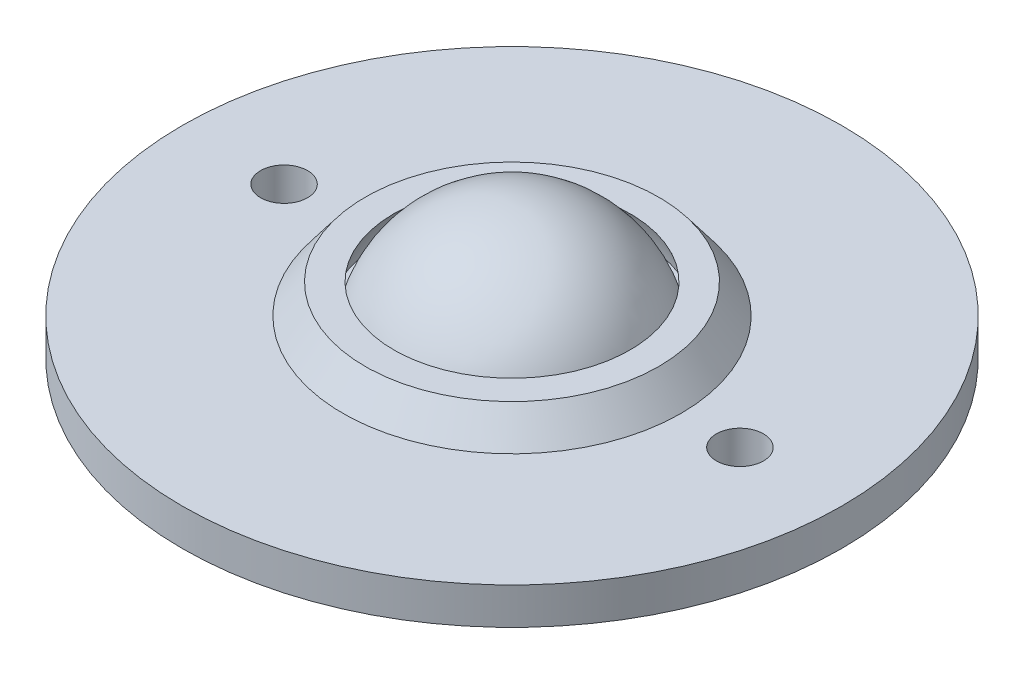
ISO-10303-21;
HEADER;
FILE_DESCRIPTION(('STEP AP214'),'2;1');
FILE_NAME('part.step','',(''),(''),'','','');
FILE_SCHEMA(('AUTOMOTIVE_DESIGN { 1 0 10303 214 1 1 1 1 }'));
ENDSEC;
DATA;
#1=APPLICATION_CONTEXT('core data for automotive mechanical design processes');
#2=APPLICATION_PROTOCOL_DEFINITION('international standard','automotive_design',2000,#1);
#3=PRODUCT_CONTEXT('',#1,'mechanical');
#4=PRODUCT('Part','Part','',(#3));
#5=PRODUCT_RELATED_PRODUCT_CATEGORY('part','',(#4));
#6=PRODUCT_DEFINITION_FORMATION('','',#4);
#7=PRODUCT_DEFINITION_CONTEXT('part definition',#1,'design');
#8=PRODUCT_DEFINITION('design','',#6,#7);
#9=PRODUCT_DEFINITION_SHAPE('','',#8);
#10=(LENGTH_UNIT() NAMED_UNIT(*) SI_UNIT(.MILLI.,.METRE.));
#11=(NAMED_UNIT(*) PLANE_ANGLE_UNIT() SI_UNIT($,.RADIAN.));
#12=(NAMED_UNIT(*) SI_UNIT($,.STERADIAN.) SOLID_ANGLE_UNIT());
#13=UNCERTAINTY_MEASURE_WITH_UNIT(LENGTH_MEASURE(1.E-05),#10,'distance_accuracy_value','');
#14=(GEOMETRIC_REPRESENTATION_CONTEXT(3) GLOBAL_UNCERTAINTY_ASSIGNED_CONTEXT((#13)) GLOBAL_UNIT_ASSIGNED_CONTEXT((#10,
#11,#12)) REPRESENTATION_CONTEXT('',''));
#15=CARTESIAN_POINT('',(0.,0.,0.));
#16=DIRECTION('',(0.,0.,1.));
#17=DIRECTION('',(1.,0.,0.));
#18=AXIS2_PLACEMENT_3D('',#15,#16,#17);
#19=CARTESIAN_POINT('',(0.,-1.09899153511606,0.));
#20=DIRECTION('',(0.,-1.,0.));
#21=DIRECTION('',(-1.,0.,0.));
#22=AXIS2_PLACEMENT_3D('',#19,#20,#21);
#23=SPHERICAL_SURFACE('',#22,9.);
#24=CARTESIAN_POINT('',(0.,0.961485209223222,0.));
#25=DIRECTION('',(0.,-1.,0.));
#26=DIRECTION('',(1.,0.,0.));
#27=AXIS2_PLACEMENT_3D('',#24,#25,#26);
#28=CIRCLE('',#27,8.76096088257658);
#29=CARTESIAN_POINT('',(-8.76096088257659,0.961485209223198,0.));
#30=VERTEX_POINT('',#29);
#31=EDGE_CURVE('E51',#30,#30,#28,.T.);
#32=CARTESIAN_POINT('',(0.,2.96148520922322,0.));
#33=DIRECTION('',(0.,-1.,0.));
#34=DIRECTION('',(1.,0.,0.));
#35=AXIS2_PLACEMENT_3D('',#32,#33,#34);
#36=CIRCLE('',#35,8.0319691613377);
#37=CARTESIAN_POINT('',(-8.03196916133771,2.9614852092232,0.));
#38=VERTEX_POINT('',#37);
#39=EDGE_CURVE('E41',#38,#38,#36,.T.);
#40=CARTESIAN_POINT('',(-8.76096088257659,0.961485209223198,0.));
#41=CARTESIAN_POINT('',(-8.7558723918076,0.983121019142818,0.));
#42=CARTESIAN_POINT('',(-8.75070375120882,1.00473797872741,0.));
#43=CARTESIAN_POINT('',(-8.74020646097857,1.04793301238198,0.));
#44=CARTESIAN_POINT('',(-8.7348778113471,1.06951108645197,0.));
#45=CARTESIAN_POINT('',(-8.7240607936784,1.11262716423276,0.));
#46=CARTESIAN_POINT('',(-8.71857242564116,1.13416516794357,0.));
#47=CARTESIAN_POINT('',(-8.7074362729079,1.17719992293278,0.));
#48=CARTESIAN_POINT('',(-8.70178848821187,1.19869667421118,0.));
#49=CARTESIAN_POINT('',(-8.69033381202761,1.24164774437339,0.));
#50=CARTESIAN_POINT('',(-8.68452692053937,1.26310206325719,0.));
#51=CARTESIAN_POINT('',(-8.67275434953942,1.30596709103813,0.));
#52=CARTESIAN_POINT('',(-8.6667886700277,1.32737779993526,0.));
#53=CARTESIAN_POINT('',(-8.65469885041989,1.3701544325335,0.));
#54=CARTESIAN_POINT('',(-8.64857471032381,1.3915203562346,0.));
#55=CARTESIAN_POINT('',(-8.63616830569623,1.43420624569255,0.));
#56=CARTESIAN_POINT('',(-8.62988604116474,1.45552621144939,0.));
#57=CARTESIAN_POINT('',(-8.61716373249131,1.49811901479239,0.));
#58=CARTESIAN_POINT('',(-8.61072368834938,1.51939185237855,0.));
#59=CARTESIAN_POINT('',(-8.59768617394122,1.56188923174075,0.));
#60=CARTESIAN_POINT('',(-8.59108870367499,1.5831137735168,0.));
#61=CARTESIAN_POINT('',(-8.5777366991451,1.62551339627021,0.));
#62=CARTESIAN_POINT('',(-8.57098216488143,1.64668847724757,0.));
#63=CARTESIAN_POINT('',(-8.5573164031046,1.68898801612989,0.));
#64=CARTESIAN_POINT('',(-8.55040517559144,1.71011247403485,0.));
#65=CARTESIAN_POINT('',(-8.53642640666427,1.75230960727727,0.));
#66=CARTESIAN_POINT('',(-8.52935886525026,1.77338228261474,0.));
#67=CARTESIAN_POINT('',(-8.5150678564499,1.81547469406937,0.));
#68=CARTESIAN_POINT('',(-8.50784438906355,1.83649443018653,0.));
#69=CARTESIAN_POINT('',(-8.4932419248056,1.87847980945352,0.));
#70=CARTESIAN_POINT('',(-8.48586292793401,1.89944545260335,0.));
#71=CARTESIAN_POINT('',(-8.47094980972949,1.94132149515773,0.));
#72=CARTESIAN_POINT('',(-8.46341568839656,1.96223189456227,0.));
#73=CARTESIAN_POINT('',(-8.44819273480788,2.0039963018804,0.));
#74=CARTESIAN_POINT('',(-8.44050390255212,2.02485030979399,0.));
#75=CARTESIAN_POINT('',(-8.42497194914817,2.06650078947976,0.));
#76=CARTESIAN_POINT('',(-8.41712882799998,2.08729726125196,0.));
#77=CARTESIAN_POINT('',(-8.40128872731027,2.12883152716262,0.));
#78=CARTESIAN_POINT('',(-8.39329174776875,2.14956932130109,0.));
#79=CARTESIAN_POINT('',(-8.3771443692366,2.1909850936727,0.));
#80=CARTESIAN_POINT('',(-8.36899397024596,2.21166307190585,0.));
#81=CARTESIAN_POINT('',(-8.35254020018079,2.25295807747844,0.));
#82=CARTESIAN_POINT('',(-8.34423682910626,2.27357510481789,0.));
#83=CARTESIAN_POINT('',(-8.32747757063495,2.31474707696023,0.));
#84=CARTESIAN_POINT('',(-8.31902168323817,2.33530202176312,0.));
#85=CARTESIAN_POINT('',(-8.30195785625545,2.37634870059712,0.));
#86=CARTESIAN_POINT('',(-8.29334991666951,2.39684043462823,0.));
#87=CARTESIAN_POINT('',(-8.27598245778755,2.43775956715302,0.));
#88=CARTESIAN_POINT('',(-8.26722293849153,2.4581869656467,0.));
#89=CARTESIAN_POINT('',(-8.24955280098832,2.49897630586219,0.));
#90=CARTESIAN_POINT('',(-8.24064218278112,2.519338247584,0.));
#91=CARTESIAN_POINT('',(-8.22267033654886,2.55999555661452,0.));
#92=CARTESIAN_POINT('',(-8.2136091085238,2.58029092392323,0.));
#93=CARTESIAN_POINT('',(-8.19533654001296,2.62081397013906,0.));
#94=CARTESIAN_POINT('',(-8.18612519952716,2.64104164904618,0.));
#95=CARTESIAN_POINT('',(-8.16755291170262,2.68142820819117,0.));
#96=CARTESIAN_POINT('',(-8.15819196436387,2.70158708842905,0.));
#97=CARTESIAN_POINT('',(-8.13932097661119,2.7418349437235,0.));
#98=CARTESIAN_POINT('',(-8.12981093619727,2.76192391878008,0.));
#99=CARTESIAN_POINT('',(-8.11064228441132,2.80203086111415,0.));
#100=CARTESIAN_POINT('',(-8.10098367303929,2.82204882839166,0.));
#101=CARTESIAN_POINT('',(-8.0815184090278,2.86201265617889,0.));
#102=CARTESIAN_POINT('',(-8.07171175638833,2.88195851668861,0.));
#103=CARTESIAN_POINT('',(-8.05195094982778,2.92177703698601,0.));
#104=CARTESIAN_POINT('',(-8.04199679590669,2.94164969677368,0.));
#105=CARTESIAN_POINT('',(-8.03196916133771,2.9614852092232,0.));
#106=B_SPLINE_CURVE_WITH_KNOTS('',3,(#40,#41,#42,#43,#44,#45,#46,#47,#48,#49,#50,#51,#52,#53,
#54,#55,#56,#57,#58,#59,#60,#61,#62,#63,#64,#65,#66,#67,#68,#69,#70,#71,#72,#73,#74,#75,#76,#77,
#78,#79,#80,#81,#82,#83,#84,#85,#86,#87,#88,#89,#90,#91,#92,#93,#94,#95,#96,#97,#98,#99,#100,
#101,#102,#103,#104,#105),.UNSPECIFIED.,.F.,.F.,(4,2,2,2,2,2,2,2,2,2,2,2,2,2,2,2,2,2,2,2,2,2,2,
2,2,2,2,2,2,2,2,2,4),(0.,0.066678247889509,0.133356495779018,0.200034743668528,
0.266712991558037,0.333391239447546,0.400069487337055,0.466747735226565,0.533425983116074,
0.600104231005584,0.666782478895092,0.733460726784602,0.800138974674111,0.86681722256362,
0.93349547045313,1.00017371834264,1.06685196623215,1.13353021412166,1.20020846201117,
1.26688670990067,1.33356495779018,1.40024320567969,1.4669214535692,1.53359970145871,
1.60027794934822,1.66695619723773,1.73363444512724,1.80031269301675,1.86699094090626,
1.93366918879577,2.00034743668528,2.06702568457479,2.1337039324643),.UNSPECIFIED.);
#107=EDGE_CURVE('BSEAM34',#30,#38,#106,.T.);
#108=ORIENTED_EDGE('',*,*,#31,.T.);
#109=ORIENTED_EDGE('',*,*,#39,.F.);
#110=ORIENTED_EDGE('',*,*,#107,.T.);
#111=ORIENTED_EDGE('',*,*,#107,.F.);
#112=EDGE_LOOP('',(#108,#110,#109,#111));
#113=FACE_BOUND('',#112,.T.);
#114=ADVANCED_FACE('F34',(#113),#23,.F.);
#115=CARTESIAN_POINT('',(0.,2.96148520922322,0.));
#116=DIRECTION('',(0.,1.,0.));
#117=DIRECTION('',(-1.,0.,0.));
#118=AXIS2_PLACEMENT_3D('',#115,#116,#117);
#119=PLANE('',#118);
#120=ORIENTED_EDGE('',*,*,#39,.T.);
#121=EDGE_LOOP('',(#120));
#122=FACE_BOUND('',#121,.T.);
#123=CARTESIAN_POINT('',(0.,2.96148520922323,0.));
#124=DIRECTION('',(0.,-1.,0.));
#125=DIRECTION('',(1.,0.,0.));
#126=AXIS2_PLACEMENT_3D('',#123,#124,#125);
#127=CIRCLE('',#126,9.97875475079486);
#128=CARTESIAN_POINT('',(9.97875475079485,2.96148520922325,0.));
#129=VERTEX_POINT('',#128);
#130=EDGE_CURVE('E46',#129,#129,#127,.T.);
#131=ORIENTED_EDGE('',*,*,#130,.F.);
#132=EDGE_LOOP('',(#131));
#133=FACE_BOUND('',#132,.T.);
#134=ADVANCED_FACE('F82',(#122,#133),#119,.T.);
#135=CARTESIAN_POINT('',(0.,0.961485209223229,0.));
#136=DIRECTION('',(0.,-1.,0.));
#137=DIRECTION('',(1.,0.,0.));
#138=AXIS2_PLACEMENT_3D('',#135,#136,#137);
#139=CONICAL_SURFACE('',#138,11.5,0.650264996744957);
#140=ORIENTED_EDGE('',*,*,#130,.T.);
#141=EDGE_LOOP('',(#140));
#142=FACE_BOUND('',#141,.T.);
#143=CARTESIAN_POINT('',(0.,0.961485209223229,0.));
#144=DIRECTION('',(0.,-1.,0.));
#145=DIRECTION('',(1.,0.,0.));
#146=AXIS2_PLACEMENT_3D('',#143,#144,#145);
#147=CIRCLE('',#146,11.5);
#148=CARTESIAN_POINT('',(11.5,0.96148520922326,0.));
#149=VERTEX_POINT('',#148);
#150=EDGE_CURVE('E74',#149,#149,#147,.T.);
#151=ORIENTED_EDGE('',*,*,#150,.F.);
#152=EDGE_LOOP('',(#151));
#153=FACE_BOUND('',#152,.T.);
#154=ADVANCED_FACE('F79',(#142,#153),#139,.T.);
#155=CARTESIAN_POINT('',(0.,0.961485209223244,0.));
#156=DIRECTION('',(0.,1.,0.));
#157=DIRECTION('',(-1.,0.,0.));
#158=AXIS2_PLACEMENT_3D('',#155,#156,#157);
#159=PLANE('',#158);
#160=CARTESIAN_POINT('',(15.5,0.961485209223285,0.));
#161=DIRECTION('',(0.,1.,0.));
#162=DIRECTION('',(1.,0.,0.));
#163=AXIS2_PLACEMENT_3D('',#160,#161,#162);
#164=CIRCLE('',#163,1.6);
#165=CARTESIAN_POINT('',(17.1,0.96148520922329,0.));
#166=VERTEX_POINT('',#165);
#167=EDGE_CURVE('E63',#166,#166,#164,.T.);
#168=ORIENTED_EDGE('',*,*,#167,.F.);
#169=EDGE_LOOP('',(#168));
#170=FACE_BOUND('',#169,.T.);
#171=CARTESIAN_POINT('',(-15.5,0.961485209223202,0.));
#172=DIRECTION('',(0.,1.,0.));
#173=DIRECTION('',(-1.,0.,0.));
#174=AXIS2_PLACEMENT_3D('',#171,#172,#173);
#175=CIRCLE('',#174,1.6);
#176=CARTESIAN_POINT('',(-17.1,0.961485209223198,0.));
#177=VERTEX_POINT('',#176);
#178=EDGE_CURVE('E52',#177,#177,#175,.T.);
#179=ORIENTED_EDGE('',*,*,#178,.F.);
#180=EDGE_LOOP('',(#179));
#181=FACE_BOUND('',#180,.T.);
#182=ORIENTED_EDGE('',*,*,#150,.T.);
#183=EDGE_LOOP('',(#182));
#184=FACE_BOUND('',#183,.T.);
#185=CARTESIAN_POINT('',(0.,0.961485209223258,0.));
#186=DIRECTION('',(0.,-1.,0.));
#187=DIRECTION('',(1.,0.,0.));
#188=AXIS2_PLACEMENT_3D('',#185,#186,#187);
#189=CIRCLE('',#188,22.4202038461932);
#190=CARTESIAN_POINT('',(22.4202038461931,0.961485209223319,0.));
#191=VERTEX_POINT('',#190);
#192=EDGE_CURVE('E71',#191,#191,#189,.T.);
#193=ORIENTED_EDGE('',*,*,#192,.F.);
#194=EDGE_LOOP('',(#193));
#195=FACE_BOUND('',#194,.T.);
#196=ADVANCED_FACE('F89',(#170,#181,#184,#195),#159,.T.);
#197=CARTESIAN_POINT('',(0.,0.,0.));
#198=DIRECTION('',(0.,-1.,0.));
#199=DIRECTION('',(1.,0.,0.));
#200=AXIS2_PLACEMENT_3D('',#197,#198,#199);
#201=CYLINDRICAL_SURFACE('',#200,22.4202038461932);
#202=CARTESIAN_POINT('',(0.,-1.53851479077674,0.));
#203=DIRECTION('',(0.,-1.,0.));
#204=DIRECTION('',(1.,0.,0.));
#205=AXIS2_PLACEMENT_3D('',#202,#203,#204);
#206=CIRCLE('',#205,22.4202038461932);
#207=CARTESIAN_POINT('',(22.4202038461932,-1.53851479077668,0.));
#208=VERTEX_POINT('',#207);
#209=EDGE_CURVE('E68',#208,#208,#206,.T.);
#210=ORIENTED_EDGE('',*,*,#209,.F.);
#211=EDGE_LOOP('',(#210));
#212=FACE_BOUND('',#211,.T.);
#213=ORIENTED_EDGE('',*,*,#192,.T.);
#214=EDGE_LOOP('',(#213));
#215=FACE_BOUND('',#214,.T.);
#216=ADVANCED_FACE('F95',(#212,#215),#201,.T.);
#217=CARTESIAN_POINT('',(0.,-1.53851479077675,0.));
#218=DIRECTION('',(0.,1.,0.));
#219=DIRECTION('',(-1.,0.,0.));
#220=AXIS2_PLACEMENT_3D('',#217,#218,#219);
#221=PLANE('',#220);
#222=CARTESIAN_POINT('',(15.5,-1.53851479077671,0.));
#223=DIRECTION('',(0.,1.,0.));
#224=DIRECTION('',(-1.,0.,0.));
#225=AXIS2_PLACEMENT_3D('',#222,#223,#224);
#226=CIRCLE('',#225,1.6);
#227=CARTESIAN_POINT('',(13.9,-1.53851479077672,0.));
#228=VERTEX_POINT('',#227);
#229=EDGE_CURVE('E37',#228,#228,#226,.T.);
#230=ORIENTED_EDGE('',*,*,#229,.T.);
#231=EDGE_LOOP('',(#230));
#232=FACE_BOUND('',#231,.T.);
#233=CARTESIAN_POINT('',(-15.5,-1.5385147907768,0.));
#234=DIRECTION('',(0.,1.,0.));
#235=DIRECTION('',(-1.,0.,0.));
#236=AXIS2_PLACEMENT_3D('',#233,#234,#235);
#237=CIRCLE('',#236,1.6);
#238=CARTESIAN_POINT('',(-17.1,-1.5385147907768,0.));
#239=VERTEX_POINT('',#238);
#240=EDGE_CURVE('E49',#239,#239,#237,.T.);
#241=ORIENTED_EDGE('',*,*,#240,.T.);
#242=EDGE_LOOP('',(#241));
#243=FACE_BOUND('',#242,.T.);
#244=CARTESIAN_POINT('',(0.,-1.53851479077677,0.));
#245=DIRECTION('',(0.,-1.,0.));
#246=DIRECTION('',(1.,0.,0.));
#247=AXIS2_PLACEMENT_3D('',#244,#245,#246);
#248=CIRCLE('',#247,12.4049575669795);
#249=CARTESIAN_POINT('',(12.4049575669795,-1.53851479077673,0.));
#250=VERTEX_POINT('',#249);
#251=EDGE_CURVE('E56',#250,#250,#248,.T.);
#252=ORIENTED_EDGE('',*,*,#251,.F.);
#253=EDGE_LOOP('',(#252));
#254=FACE_BOUND('',#253,.T.);
#255=ORIENTED_EDGE('',*,*,#209,.T.);
#256=EDGE_LOOP('',(#255));
#257=FACE_BOUND('',#256,.T.);
#258=ADVANCED_FACE('F99',(#232,#243,#254,#257),#221,.F.);
#259=CARTESIAN_POINT('',(0.,0.,0.));
#260=DIRECTION('',(0.,-1.,0.));
#261=DIRECTION('',(-1.,0.,0.));
#262=AXIS2_PLACEMENT_3D('',#259,#260,#261);
#263=SPHERICAL_SURFACE('',#262,12.5);
#264=ORIENTED_EDGE('',*,*,#251,.T.);
#265=EDGE_LOOP('',(#264));
#266=FACE_BOUND('',#265,.T.);
#267=ADVANCED_FACE('F103',(#266),#263,.T.);
#268=CARTESIAN_POINT('',(0.,0.96148520922321,0.));
#269=DIRECTION('',(0.,-1.,0.));
#270=DIRECTION('',(1.,0.,0.));
#271=AXIS2_PLACEMENT_3D('',#268,#269,#270);
#272=PLANE('',#271);
#273=CARTESIAN_POINT('',(0.,0.96148520922321,0.));
#274=DIRECTION('',(0.,-1.,0.));
#275=DIRECTION('',(1.,0.,0.));
#276=AXIS2_PLACEMENT_3D('',#273,#274,#275);
#277=CIRCLE('',#276,8.34847836477011);
#278=CARTESIAN_POINT('',(8.34847836477011,0.961485209223232,0.));
#279=VERTEX_POINT('',#278);
#280=EDGE_CURVE('E10',#279,#279,#277,.F.);
#281=ORIENTED_EDGE('',*,*,#280,.F.);
#282=EDGE_LOOP('',(#281));
#283=FACE_BOUND('',#282,.T.);
#284=ORIENTED_EDGE('',*,*,#31,.F.);
#285=EDGE_LOOP('',(#284));
#286=FACE_BOUND('',#285,.T.);
#287=ADVANCED_FACE('F107',(#283,#286),#272,.F.);
#288=CARTESIAN_POINT('',(0.,-1.09899153511606,0.));
#289=DIRECTION('',(0.,-1.,0.));
#290=DIRECTION('',(1.,0.,0.));
#291=AXIS2_PLACEMENT_3D('',#288,#289,#290);
#292=SPHERICAL_SURFACE('',#291,8.59899153511606);
#293=ORIENTED_EDGE('',*,*,#280,.T.);
#294=EDGE_LOOP('',(#293));
#295=FACE_BOUND('',#294,.T.);
#296=ADVANCED_FACE('F111',(#295),#292,.T.);
#297=CARTESIAN_POINT('',(-15.5,-9.0385147907768,0.));
#298=DIRECTION('',(0.,1.,0.));
#299=DIRECTION('',(-1.,0.,0.));
#300=AXIS2_PLACEMENT_3D('',#297,#298,#299);
#301=CYLINDRICAL_SURFACE('',#300,1.6);
#302=ORIENTED_EDGE('',*,*,#178,.T.);
#303=EDGE_LOOP('',(#302));
#304=FACE_BOUND('',#303,.T.);
#305=ORIENTED_EDGE('',*,*,#240,.F.);
#306=EDGE_LOOP('',(#305));
#307=FACE_BOUND('',#306,.T.);
#308=ADVANCED_FACE('F115',(#304,#307),#301,.F.);
#309=CARTESIAN_POINT('',(15.5,-9.03851479077671,0.));
#310=DIRECTION('',(0.,1.,0.));
#311=DIRECTION('',(-1.,0.,0.));
#312=AXIS2_PLACEMENT_3D('',#309,#310,#311);
#313=CYLINDRICAL_SURFACE('',#312,1.6);
#314=ORIENTED_EDGE('',*,*,#167,.T.);
#315=EDGE_LOOP('',(#314));
#316=FACE_BOUND('',#315,.T.);
#317=ORIENTED_EDGE('',*,*,#229,.F.);
#318=EDGE_LOOP('',(#317));
#319=FACE_BOUND('',#318,.T.);
#320=ADVANCED_FACE('F118',(#316,#319),#313,.F.);
#321=CLOSED_SHELL('',(#114,#134,#154,#196,#216,#258,#267,#287,#296,#308,#320));
#322=MANIFOLD_SOLID_BREP('B2',#321);
#323=ADVANCED_BREP_SHAPE_REPRESENTATION('',(#18,#322),#14);
#324=SHAPE_DEFINITION_REPRESENTATION(#9,#323);
ENDSEC;
END-ISO-10303-21;
